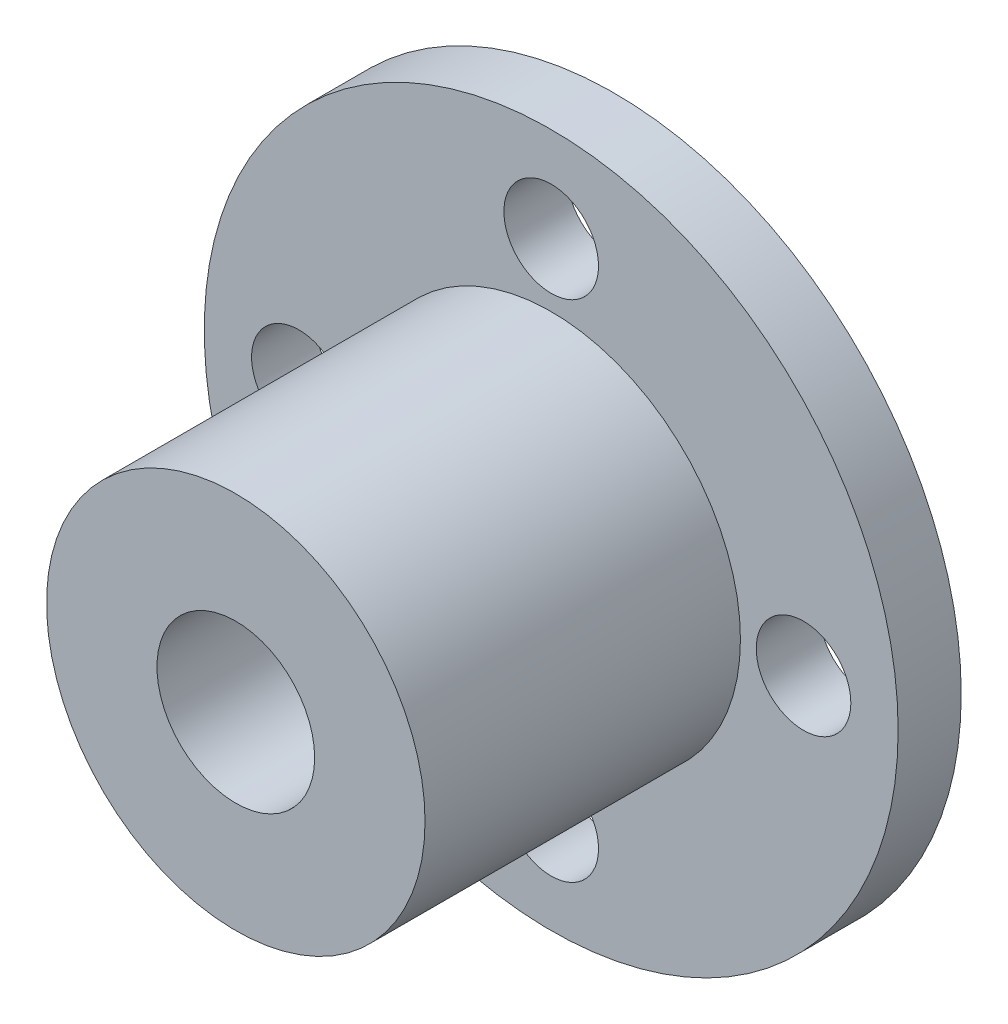
ISO-10303-21;
HEADER;
FILE_DESCRIPTION(('STEP AP214'),'2;1');
FILE_NAME('part.step','',(''),(''),'','','');
FILE_SCHEMA(('AUTOMOTIVE_DESIGN { 1 0 10303 214 1 1 1 1 }'));
ENDSEC;
DATA;
#1=APPLICATION_CONTEXT('core data for automotive mechanical design processes');
#2=APPLICATION_PROTOCOL_DEFINITION('international standard','automotive_design',2000,#1);
#3=PRODUCT_CONTEXT('',#1,'mechanical');
#4=PRODUCT('Part','Part','',(#3));
#5=PRODUCT_RELATED_PRODUCT_CATEGORY('part','',(#4));
#6=PRODUCT_DEFINITION_FORMATION('','',#4);
#7=PRODUCT_DEFINITION_CONTEXT('part definition',#1,'design');
#8=PRODUCT_DEFINITION('design','',#6,#7);
#9=PRODUCT_DEFINITION_SHAPE('','',#8);
#10=(LENGTH_UNIT() NAMED_UNIT(*) SI_UNIT(.MILLI.,.METRE.));
#11=(NAMED_UNIT(*) PLANE_ANGLE_UNIT() SI_UNIT($,.RADIAN.));
#12=(NAMED_UNIT(*) SI_UNIT($,.STERADIAN.) SOLID_ANGLE_UNIT());
#13=UNCERTAINTY_MEASURE_WITH_UNIT(LENGTH_MEASURE(1.E-05),#10,'distance_accuracy_value','');
#14=(GEOMETRIC_REPRESENTATION_CONTEXT(3) GLOBAL_UNCERTAINTY_ASSIGNED_CONTEXT((#13)) GLOBAL_UNIT_ASSIGNED_CONTEXT((#10,
#11,#12)) REPRESENTATION_CONTEXT('',''));
#15=CARTESIAN_POINT('',(0.,0.,0.));
#16=DIRECTION('',(0.,0.,1.));
#17=DIRECTION('',(1.,0.,0.));
#18=AXIS2_PLACEMENT_3D('',#15,#16,#17);
#19=CARTESIAN_POINT('',(0.,0.,2.));
#20=DIRECTION('',(0.,0.,-1.));
#21=DIRECTION('',(-1.,0.,0.));
#22=AXIS2_PLACEMENT_3D('',#19,#20,#21);
#23=CYLINDRICAL_SURFACE('',#22,11.);
#24=CARTESIAN_POINT('',(0.,0.,2.));
#25=DIRECTION('',(0.,0.,1.));
#26=DIRECTION('',(1.,0.,0.));
#27=AXIS2_PLACEMENT_3D('',#24,#25,#26);
#28=CIRCLE('',#27,11.);
#29=CARTESIAN_POINT('',(11.,0.,2.));
#30=VERTEX_POINT('',#29);
#31=EDGE_CURVE('E43',#30,#30,#28,.T.);
#32=ORIENTED_EDGE('',*,*,#31,.F.);
#33=EDGE_LOOP('',(#32));
#34=FACE_BOUND('',#33,.T.);
#35=CARTESIAN_POINT('',(0.,0.,0.));
#36=DIRECTION('',(0.,0.,1.));
#37=DIRECTION('',(1.,0.,0.));
#38=AXIS2_PLACEMENT_3D('',#35,#36,#37);
#39=CIRCLE('',#38,11.);
#40=CARTESIAN_POINT('',(11.,0.,0.));
#41=VERTEX_POINT('',#40);
#42=EDGE_CURVE('E39',#41,#41,#39,.T.);
#43=ORIENTED_EDGE('',*,*,#42,.T.);
#44=EDGE_LOOP('',(#43));
#45=FACE_BOUND('',#44,.T.);
#46=ADVANCED_FACE('F36',(#34,#45),#23,.T.);
#47=CARTESIAN_POINT('',(0.,0.,2.));
#48=DIRECTION('',(0.,0.,1.));
#49=DIRECTION('',(1.,0.,0.));
#50=AXIS2_PLACEMENT_3D('',#47,#48,#49);
#51=PLANE('',#50);
#52=CARTESIAN_POINT('',(0.,8.,2.));
#53=DIRECTION('',(0.,0.,1.));
#54=DIRECTION('',(1.,0.,0.));
#55=AXIS2_PLACEMENT_3D('',#52,#53,#54);
#56=CIRCLE('',#55,1.5);
#57=CARTESIAN_POINT('',(1.5,8.,2.));
#58=VERTEX_POINT('',#57);
#59=EDGE_CURVE('E77',#58,#58,#56,.T.);
#60=ORIENTED_EDGE('',*,*,#59,.F.);
#61=EDGE_LOOP('',(#60));
#62=FACE_BOUND('',#61,.T.);
#63=CARTESIAN_POINT('',(8.,0.,2.));
#64=DIRECTION('',(0.,0.,1.));
#65=DIRECTION('',(1.,0.,0.));
#66=AXIS2_PLACEMENT_3D('',#63,#64,#65);
#67=CIRCLE('',#66,1.5);
#68=CARTESIAN_POINT('',(9.5,0.,2.));
#69=VERTEX_POINT('',#68);
#70=EDGE_CURVE('E74',#69,#69,#67,.T.);
#71=ORIENTED_EDGE('',*,*,#70,.F.);
#72=EDGE_LOOP('',(#71));
#73=FACE_BOUND('',#72,.T.);
#74=CARTESIAN_POINT('',(0.,-8.,2.));
#75=DIRECTION('',(0.,0.,1.));
#76=DIRECTION('',(1.,0.,0.));
#77=AXIS2_PLACEMENT_3D('',#74,#75,#76);
#78=CIRCLE('',#77,1.5);
#79=CARTESIAN_POINT('',(1.5,-8.,2.));
#80=VERTEX_POINT('',#79);
#81=EDGE_CURVE('E68',#80,#80,#78,.T.);
#82=ORIENTED_EDGE('',*,*,#81,.F.);
#83=EDGE_LOOP('',(#82));
#84=FACE_BOUND('',#83,.T.);
#85=CARTESIAN_POINT('',(-8.,0.,2.));
#86=DIRECTION('',(0.,0.,1.));
#87=DIRECTION('',(1.,0.,0.));
#88=AXIS2_PLACEMENT_3D('',#85,#86,#87);
#89=CIRCLE('',#88,1.5);
#90=CARTESIAN_POINT('',(-6.5,0.,2.));
#91=VERTEX_POINT('',#90);
#92=EDGE_CURVE('E62',#91,#91,#89,.T.);
#93=ORIENTED_EDGE('',*,*,#92,.F.);
#94=EDGE_LOOP('',(#93));
#95=FACE_BOUND('',#94,.T.);
#96=CARTESIAN_POINT('',(0.,0.,2.));
#97=DIRECTION('',(0.,0.,1.));
#98=DIRECTION('',(1.,0.,0.));
#99=AXIS2_PLACEMENT_3D('',#96,#97,#98);
#100=CIRCLE('',#99,6.);
#101=CARTESIAN_POINT('',(6.,0.,2.));
#102=VERTEX_POINT('',#101);
#103=EDGE_CURVE('E10',#102,#102,#100,.T.);
#104=ORIENTED_EDGE('',*,*,#103,.F.);
#105=EDGE_LOOP('',(#104));
#106=FACE_BOUND('',#105,.T.);
#107=ORIENTED_EDGE('',*,*,#31,.T.);
#108=EDGE_LOOP('',(#107));
#109=FACE_BOUND('',#108,.T.);
#110=ADVANCED_FACE('F93',(#62,#73,#84,#95,#106,#109),#51,.T.);
#111=CARTESIAN_POINT('',(0.,0.,0.));
#112=DIRECTION('',(0.,0.,1.));
#113=DIRECTION('',(1.,0.,0.));
#114=AXIS2_PLACEMENT_3D('',#111,#112,#113);
#115=PLANE('',#114);
#116=CARTESIAN_POINT('',(0.,8.,0.));
#117=DIRECTION('',(0.,0.,1.));
#118=DIRECTION('',(1.,0.,0.));
#119=AXIS2_PLACEMENT_3D('',#116,#117,#118);
#120=CIRCLE('',#119,1.5);
#121=CARTESIAN_POINT('',(1.5,8.,0.));
#122=VERTEX_POINT('',#121);
#123=EDGE_CURVE('E56',#122,#122,#120,.T.);
#124=ORIENTED_EDGE('',*,*,#123,.T.);
#125=EDGE_LOOP('',(#124));
#126=FACE_BOUND('',#125,.T.);
#127=CARTESIAN_POINT('',(8.,0.,0.));
#128=DIRECTION('',(0.,0.,1.));
#129=DIRECTION('',(1.,0.,0.));
#130=AXIS2_PLACEMENT_3D('',#127,#128,#129);
#131=CIRCLE('',#130,1.5);
#132=CARTESIAN_POINT('',(9.5,0.,0.));
#133=VERTEX_POINT('',#132);
#134=EDGE_CURVE('E71',#133,#133,#131,.T.);
#135=ORIENTED_EDGE('',*,*,#134,.T.);
#136=EDGE_LOOP('',(#135));
#137=FACE_BOUND('',#136,.T.);
#138=CARTESIAN_POINT('',(0.,-8.,0.));
#139=DIRECTION('',(0.,0.,1.));
#140=DIRECTION('',(1.,0.,0.));
#141=AXIS2_PLACEMENT_3D('',#138,#139,#140);
#142=CIRCLE('',#141,1.5);
#143=CARTESIAN_POINT('',(1.5,-8.,0.));
#144=VERTEX_POINT('',#143);
#145=EDGE_CURVE('E65',#144,#144,#142,.T.);
#146=ORIENTED_EDGE('',*,*,#145,.T.);
#147=EDGE_LOOP('',(#146));
#148=FACE_BOUND('',#147,.T.);
#149=CARTESIAN_POINT('',(-8.,0.,0.));
#150=DIRECTION('',(0.,0.,1.));
#151=DIRECTION('',(1.,0.,0.));
#152=AXIS2_PLACEMENT_3D('',#149,#150,#151);
#153=CIRCLE('',#152,1.5);
#154=CARTESIAN_POINT('',(-6.5,0.,0.));
#155=VERTEX_POINT('',#154);
#156=EDGE_CURVE('E59',#155,#155,#153,.T.);
#157=ORIENTED_EDGE('',*,*,#156,.T.);
#158=EDGE_LOOP('',(#157));
#159=FACE_BOUND('',#158,.T.);
#160=CARTESIAN_POINT('',(0.,0.,0.));
#161=DIRECTION('',(0.,0.,1.));
#162=DIRECTION('',(1.,0.,0.));
#163=AXIS2_PLACEMENT_3D('',#160,#161,#162);
#164=CIRCLE('',#163,2.5);
#165=CARTESIAN_POINT('',(2.5,0.,0.));
#166=VERTEX_POINT('',#165);
#167=EDGE_CURVE('E52',#166,#166,#164,.T.);
#168=ORIENTED_EDGE('',*,*,#167,.T.);
#169=EDGE_LOOP('',(#168));
#170=FACE_BOUND('',#169,.T.);
#171=ORIENTED_EDGE('',*,*,#42,.F.);
#172=EDGE_LOOP('',(#171));
#173=FACE_BOUND('',#172,.T.);
#174=ADVANCED_FACE('F83',(#126,#137,#148,#159,#170,#173),#115,.F.);
#175=CARTESIAN_POINT('',(0.,0.,12.));
#176=DIRECTION('',(0.,0.,-1.));
#177=DIRECTION('',(-1.,0.,0.));
#178=AXIS2_PLACEMENT_3D('',#175,#176,#177);
#179=CYLINDRICAL_SURFACE('',#178,6.);
#180=CARTESIAN_POINT('',(0.,0.,12.));
#181=DIRECTION('',(0.,0.,1.));
#182=DIRECTION('',(1.,0.,0.));
#183=AXIS2_PLACEMENT_3D('',#180,#181,#182);
#184=CIRCLE('',#183,6.);
#185=CARTESIAN_POINT('',(6.,0.,12.));
#186=VERTEX_POINT('',#185);
#187=EDGE_CURVE('E49',#186,#186,#184,.T.);
#188=ORIENTED_EDGE('',*,*,#187,.F.);
#189=EDGE_LOOP('',(#188));
#190=FACE_BOUND('',#189,.T.);
#191=ORIENTED_EDGE('',*,*,#103,.T.);
#192=EDGE_LOOP('',(#191));
#193=FACE_BOUND('',#192,.T.);
#194=ADVANCED_FACE('F112',(#190,#193),#179,.T.);
#195=CARTESIAN_POINT('',(0.,0.,12.));
#196=DIRECTION('',(0.,0.,1.));
#197=DIRECTION('',(1.,0.,0.));
#198=AXIS2_PLACEMENT_3D('',#195,#196,#197);
#199=PLANE('',#198);
#200=CARTESIAN_POINT('',(0.,0.,12.));
#201=DIRECTION('',(0.,0.,1.));
#202=DIRECTION('',(1.,0.,0.));
#203=AXIS2_PLACEMENT_3D('',#200,#201,#202);
#204=CIRCLE('',#203,2.5);
#205=CARTESIAN_POINT('',(2.5,0.,12.));
#206=VERTEX_POINT('',#205);
#207=EDGE_CURVE('E53',#206,#206,#204,.T.);
#208=ORIENTED_EDGE('',*,*,#207,.F.);
#209=EDGE_LOOP('',(#208));
#210=FACE_BOUND('',#209,.T.);
#211=ORIENTED_EDGE('',*,*,#187,.T.);
#212=EDGE_LOOP('',(#211));
#213=FACE_BOUND('',#212,.T.);
#214=ADVANCED_FACE('F117',(#210,#213),#199,.T.);
#215=CARTESIAN_POINT('',(0.,0.,0.));
#216=DIRECTION('',(0.,0.,1.));
#217=DIRECTION('',(1.,0.,0.));
#218=AXIS2_PLACEMENT_3D('',#215,#216,#217);
#219=CYLINDRICAL_SURFACE('',#218,2.5);
#220=ORIENTED_EDGE('',*,*,#167,.F.);
#221=EDGE_LOOP('',(#220));
#222=FACE_BOUND('',#221,.T.);
#223=ORIENTED_EDGE('',*,*,#207,.T.);
#224=EDGE_LOOP('',(#223));
#225=FACE_BOUND('',#224,.T.);
#226=ADVANCED_FACE('F123',(#222,#225),#219,.F.);
#227=CARTESIAN_POINT('',(-8.,0.,0.));
#228=DIRECTION('',(0.,0.,1.));
#229=DIRECTION('',(1.,0.,0.));
#230=AXIS2_PLACEMENT_3D('',#227,#228,#229);
#231=CYLINDRICAL_SURFACE('',#230,1.5);
#232=ORIENTED_EDGE('',*,*,#156,.F.);
#233=EDGE_LOOP('',(#232));
#234=FACE_BOUND('',#233,.T.);
#235=ORIENTED_EDGE('',*,*,#92,.T.);
#236=EDGE_LOOP('',(#235));
#237=FACE_BOUND('',#236,.T.);
#238=ADVANCED_FACE('F127',(#234,#237),#231,.F.);
#239=CARTESIAN_POINT('',(0.,-8.,0.));
#240=DIRECTION('',(0.,0.,1.));
#241=DIRECTION('',(1.,0.,0.));
#242=AXIS2_PLACEMENT_3D('',#239,#240,#241);
#243=CYLINDRICAL_SURFACE('',#242,1.5);
#244=ORIENTED_EDGE('',*,*,#145,.F.);
#245=EDGE_LOOP('',(#244));
#246=FACE_BOUND('',#245,.T.);
#247=ORIENTED_EDGE('',*,*,#81,.T.);
#248=EDGE_LOOP('',(#247));
#249=FACE_BOUND('',#248,.T.);
#250=ADVANCED_FACE('F130',(#246,#249),#243,.F.);
#251=CARTESIAN_POINT('',(8.,0.,0.));
#252=DIRECTION('',(0.,0.,1.));
#253=DIRECTION('',(1.,0.,0.));
#254=AXIS2_PLACEMENT_3D('',#251,#252,#253);
#255=CYLINDRICAL_SURFACE('',#254,1.5);
#256=ORIENTED_EDGE('',*,*,#134,.F.);
#257=EDGE_LOOP('',(#256));
#258=FACE_BOUND('',#257,.T.);
#259=ORIENTED_EDGE('',*,*,#70,.T.);
#260=EDGE_LOOP('',(#259));
#261=FACE_BOUND('',#260,.T.);
#262=ADVANCED_FACE('F89',(#258,#261),#255,.F.);
#263=CARTESIAN_POINT('',(0.,8.,0.));
#264=DIRECTION('',(0.,0.,1.));
#265=DIRECTION('',(1.,0.,0.));
#266=AXIS2_PLACEMENT_3D('',#263,#264,#265);
#267=CYLINDRICAL_SURFACE('',#266,1.5);
#268=ORIENTED_EDGE('',*,*,#123,.F.);
#269=EDGE_LOOP('',(#268));
#270=FACE_BOUND('',#269,.T.);
#271=ORIENTED_EDGE('',*,*,#59,.T.);
#272=EDGE_LOOP('',(#271));
#273=FACE_BOUND('',#272,.T.);
#274=ADVANCED_FACE('F86',(#270,#273),#267,.F.);
#275=CLOSED_SHELL('',(#46,#110,#174,#194,#214,#226,#238,#250,#262,#274));
#276=MANIFOLD_SOLID_BREP('B2',#275);
#277=ADVANCED_BREP_SHAPE_REPRESENTATION('',(#18,#276),#14);
#278=SHAPE_DEFINITION_REPRESENTATION(#9,#277);
ENDSEC;
END-ISO-10303-21;
